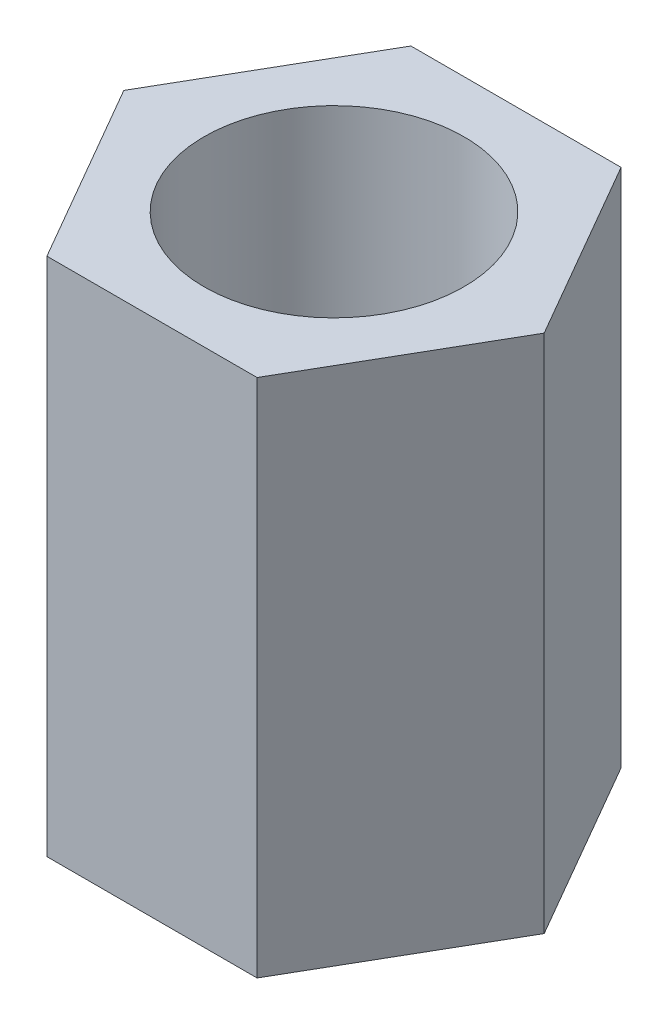
ISO-10303-21;
HEADER;
FILE_DESCRIPTION(('STEP AP214'),'2;1');
FILE_NAME('part.step','',(''),(''),'','','');
FILE_SCHEMA(('AUTOMOTIVE_DESIGN { 1 0 10303 214 1 1 1 1 }'));
ENDSEC;
DATA;
#1=APPLICATION_CONTEXT('core data for automotive mechanical design processes');
#2=APPLICATION_PROTOCOL_DEFINITION('international standard','automotive_design',2000,#1);
#3=PRODUCT_CONTEXT('',#1,'mechanical');
#4=PRODUCT('Part','Part','',(#3));
#5=PRODUCT_RELATED_PRODUCT_CATEGORY('part','',(#4));
#6=PRODUCT_DEFINITION_FORMATION('','',#4);
#7=PRODUCT_DEFINITION_CONTEXT('part definition',#1,'design');
#8=PRODUCT_DEFINITION('design','',#6,#7);
#9=PRODUCT_DEFINITION_SHAPE('','',#8);
#10=(LENGTH_UNIT() NAMED_UNIT(*) SI_UNIT(.MILLI.,.METRE.));
#11=(NAMED_UNIT(*) PLANE_ANGLE_UNIT() SI_UNIT($,.RADIAN.));
#12=(NAMED_UNIT(*) SI_UNIT($,.STERADIAN.) SOLID_ANGLE_UNIT());
#13=UNCERTAINTY_MEASURE_WITH_UNIT(LENGTH_MEASURE(1.E-05),#10,'distance_accuracy_value','');
#14=(GEOMETRIC_REPRESENTATION_CONTEXT(3) GLOBAL_UNCERTAINTY_ASSIGNED_CONTEXT((#13)) GLOBAL_UNIT_ASSIGNED_CONTEXT((#10,
#11,#12)) REPRESENTATION_CONTEXT('',''));
#15=CARTESIAN_POINT('',(0.,0.,0.));
#16=DIRECTION('',(0.,0.,1.));
#17=DIRECTION('',(1.,0.,0.));
#18=AXIS2_PLACEMENT_3D('',#15,#16,#17);
#19=CARTESIAN_POINT('',(0.,10.,0.));
#20=DIRECTION('',(0.,1.,0.));
#21=DIRECTION('',(0.,0.,1.));
#22=AXIS2_PLACEMENT_3D('',#19,#20,#21);
#23=PLANE('',#22);
#24=DIRECTION('',(-0.5,0.,-0.866025403784439));
#25=VECTOR('',#24,1.);
#26=CARTESIAN_POINT('',(4.04145188432738,10.,0.));
#27=LINE('',#26,#25);
#28=CARTESIAN_POINT('',(4.04145188432738,10.,0.));
#29=VERTEX_POINT('',#28);
#30=CARTESIAN_POINT('',(2.02072594216369,10.,-3.5));
#31=VERTEX_POINT('',#30);
#32=EDGE_CURVE('E152',#29,#31,#27,.T.);
#33=ORIENTED_EDGE('',*,*,#32,.T.);
#34=DIRECTION('',(-1.,0.,0.));
#35=VECTOR('',#34,1.);
#36=CARTESIAN_POINT('',(2.02072594216369,10.,-3.5));
#37=LINE('',#36,#35);
#38=CARTESIAN_POINT('',(-2.02072594216369,10.,-3.5));
#39=VERTEX_POINT('',#38);
#40=EDGE_CURVE('E100',#31,#39,#37,.T.);
#41=ORIENTED_EDGE('',*,*,#40,.T.);
#42=DIRECTION('',(-0.5,0.,0.866025403784438));
#43=VECTOR('',#42,1.);
#44=CARTESIAN_POINT('',(-2.02072594216369,10.,-3.5));
#45=LINE('',#44,#43);
#46=CARTESIAN_POINT('',(-4.04145188432738,10.,0.));
#47=VERTEX_POINT('',#46);
#48=EDGE_CURVE('E113',#39,#47,#45,.T.);
#49=ORIENTED_EDGE('',*,*,#48,.T.);
#50=DIRECTION('',(0.5,0.,0.866025403784439));
#51=VECTOR('',#50,1.);
#52=CARTESIAN_POINT('',(-4.04145188432738,10.,0.));
#53=LINE('',#52,#51);
#54=CARTESIAN_POINT('',(-2.02072594216369,10.,3.5));
#55=VERTEX_POINT('',#54);
#56=EDGE_CURVE('E107',#47,#55,#53,.T.);
#57=ORIENTED_EDGE('',*,*,#56,.T.);
#58=DIRECTION('',(1.,0.,0.));
#59=VECTOR('',#58,1.);
#60=CARTESIAN_POINT('',(-2.02072594216369,10.,3.5));
#61=LINE('',#60,#59);
#62=CARTESIAN_POINT('',(2.02072594216369,10.,3.5));
#63=VERTEX_POINT('',#62);
#64=EDGE_CURVE('E111',#55,#63,#61,.T.);
#65=ORIENTED_EDGE('',*,*,#64,.T.);
#66=DIRECTION('',(0.5,0.,-0.866025403784438));
#67=VECTOR('',#66,1.);
#68=CARTESIAN_POINT('',(2.02072594216369,10.,3.5));
#69=LINE('',#68,#67);
#70=EDGE_CURVE('E63',#63,#29,#69,.T.);
#71=ORIENTED_EDGE('',*,*,#70,.T.);
#72=EDGE_LOOP('',(#33,#41,#49,#57,#65,#71));
#73=FACE_BOUND('',#72,.T.);
#74=CARTESIAN_POINT('',(0.,10.,0.));
#75=DIRECTION('',(0.,1.,0.));
#76=DIRECTION('',(0.,0.,1.));
#77=AXIS2_PLACEMENT_3D('',#74,#75,#76);
#78=CIRCLE('',#77,2.5);
#79=CARTESIAN_POINT('',(0.,10.,2.5));
#80=VERTEX_POINT('',#79);
#81=EDGE_CURVE('E140',#80,#80,#78,.T.);
#82=ORIENTED_EDGE('',*,*,#81,.F.);
#83=EDGE_LOOP('',(#82));
#84=FACE_BOUND('',#83,.T.);
#85=ADVANCED_FACE('F45',(#73,#84),#23,.T.);
#86=CARTESIAN_POINT('',(0.,0.,0.));
#87=DIRECTION('',(0.,1.,0.));
#88=DIRECTION('',(0.,0.,1.));
#89=AXIS2_PLACEMENT_3D('',#86,#87,#88);
#90=PLANE('',#89);
#91=DIRECTION('',(-0.5,0.,-0.866025403784439));
#92=VECTOR('',#91,1.);
#93=CARTESIAN_POINT('',(4.04145188432738,0.,0.));
#94=LINE('',#93,#92);
#95=CARTESIAN_POINT('',(4.04145188432738,0.,0.));
#96=VERTEX_POINT('',#95);
#97=CARTESIAN_POINT('',(2.02072594216369,0.,-3.5));
#98=VERTEX_POINT('',#97);
#99=EDGE_CURVE('E135',#96,#98,#94,.T.);
#100=ORIENTED_EDGE('',*,*,#99,.F.);
#101=DIRECTION('',(0.5,0.,-0.866025403784438));
#102=VECTOR('',#101,1.);
#103=CARTESIAN_POINT('',(2.02072594216369,0.,3.5));
#104=LINE('',#103,#102);
#105=CARTESIAN_POINT('',(2.02072594216369,0.,3.5));
#106=VERTEX_POINT('',#105);
#107=EDGE_CURVE('E92',#106,#96,#104,.T.);
#108=ORIENTED_EDGE('',*,*,#107,.F.);
#109=DIRECTION('',(1.,0.,0.));
#110=VECTOR('',#109,1.);
#111=CARTESIAN_POINT('',(-2.02072594216369,0.,3.5));
#112=LINE('',#111,#110);
#113=CARTESIAN_POINT('',(-2.02072594216369,0.,3.5));
#114=VERTEX_POINT('',#113);
#115=EDGE_CURVE('E86',#114,#106,#112,.T.);
#116=ORIENTED_EDGE('',*,*,#115,.F.);
#117=DIRECTION('',(0.5,0.,0.866025403784439));
#118=VECTOR('',#117,1.);
#119=CARTESIAN_POINT('',(-4.04145188432738,0.,0.));
#120=LINE('',#119,#118);
#121=CARTESIAN_POINT('',(-4.04145188432738,0.,0.));
#122=VERTEX_POINT('',#121);
#123=EDGE_CURVE('E122',#122,#114,#120,.T.);
#124=ORIENTED_EDGE('',*,*,#123,.F.);
#125=DIRECTION('',(-0.5,0.,0.866025403784438));
#126=VECTOR('',#125,1.);
#127=CARTESIAN_POINT('',(-2.02072594216369,0.,-3.5));
#128=LINE('',#127,#126);
#129=CARTESIAN_POINT('',(-2.02072594216369,0.,-3.5));
#130=VERTEX_POINT('',#129);
#131=EDGE_CURVE('E143',#130,#122,#128,.T.);
#132=ORIENTED_EDGE('',*,*,#131,.F.);
#133=DIRECTION('',(-1.,0.,0.));
#134=VECTOR('',#133,1.);
#135=CARTESIAN_POINT('',(2.02072594216369,0.,-3.5));
#136=LINE('',#135,#134);
#137=EDGE_CURVE('E139',#98,#130,#136,.T.);
#138=ORIENTED_EDGE('',*,*,#137,.F.);
#139=EDGE_LOOP('',(#100,#108,#116,#124,#132,#138));
#140=FACE_BOUND('',#139,.T.);
#141=CARTESIAN_POINT('',(0.,0.,0.));
#142=DIRECTION('',(0.,1.,0.));
#143=DIRECTION('',(0.,0.,1.));
#144=AXIS2_PLACEMENT_3D('',#141,#142,#143);
#145=CIRCLE('',#144,2.5);
#146=CARTESIAN_POINT('',(0.,0.,2.5));
#147=VERTEX_POINT('',#146);
#148=EDGE_CURVE('E249',#147,#147,#145,.T.);
#149=ORIENTED_EDGE('',*,*,#148,.T.);
#150=EDGE_LOOP('',(#149));
#151=FACE_BOUND('',#150,.T.);
#152=ADVANCED_FACE('F165',(#140,#151),#90,.F.);
#153=CARTESIAN_POINT('',(4.04145188432738,10.,0.));
#154=DIRECTION('',(-0.866025403784438,0.,0.5));
#155=DIRECTION('',(0.5,0.,0.866025403784439));
#156=AXIS2_PLACEMENT_3D('',#153,#154,#155);
#157=PLANE('',#156);
#158=ORIENTED_EDGE('',*,*,#99,.T.);
#159=DIRECTION('',(0.,-1.,0.));
#160=VECTOR('',#159,1.);
#161=CARTESIAN_POINT('',(2.02072594216369,10.,-3.5));
#162=LINE('',#161,#160);
#163=EDGE_CURVE('E11',#31,#98,#162,.T.);
#164=ORIENTED_EDGE('',*,*,#163,.F.);
#165=ORIENTED_EDGE('',*,*,#32,.F.);
#166=DIRECTION('',(0.,-1.,0.));
#167=VECTOR('',#166,1.);
#168=CARTESIAN_POINT('',(4.04145188432738,10.,0.));
#169=LINE('',#168,#167);
#170=EDGE_CURVE('E131',#29,#96,#169,.T.);
#171=ORIENTED_EDGE('',*,*,#170,.T.);
#172=EDGE_LOOP('',(#158,#164,#165,#171));
#173=FACE_BOUND('',#172,.T.);
#174=ADVANCED_FACE('F47',(#173),#157,.F.);
#175=CARTESIAN_POINT('',(2.02072594216369,10.,-3.5));
#176=DIRECTION('',(0.,0.,1.));
#177=DIRECTION('',(1.,0.,0.));
#178=AXIS2_PLACEMENT_3D('',#175,#176,#177);
#179=PLANE('',#178);
#180=ORIENTED_EDGE('',*,*,#137,.T.);
#181=DIRECTION('',(0.,-1.,0.));
#182=VECTOR('',#181,1.);
#183=CARTESIAN_POINT('',(-2.02072594216369,10.,-3.5));
#184=LINE('',#183,#182);
#185=EDGE_CURVE('E55',#39,#130,#184,.T.);
#186=ORIENTED_EDGE('',*,*,#185,.F.);
#187=ORIENTED_EDGE('',*,*,#40,.F.);
#188=ORIENTED_EDGE('',*,*,#163,.T.);
#189=EDGE_LOOP('',(#180,#186,#187,#188));
#190=FACE_BOUND('',#189,.T.);
#191=ADVANCED_FACE('F190',(#190),#179,.F.);
#192=CARTESIAN_POINT('',(-2.02072594216369,10.,-3.5));
#193=DIRECTION('',(0.866025403784439,0.,0.5));
#194=DIRECTION('',(0.5,0.,-0.866025403784439));
#195=AXIS2_PLACEMENT_3D('',#192,#193,#194);
#196=PLANE('',#195);
#197=ORIENTED_EDGE('',*,*,#131,.T.);
#198=DIRECTION('',(0.,-1.,0.));
#199=VECTOR('',#198,1.);
#200=CARTESIAN_POINT('',(-4.04145188432738,10.,0.));
#201=LINE('',#200,#199);
#202=EDGE_CURVE('E124',#47,#122,#201,.T.);
#203=ORIENTED_EDGE('',*,*,#202,.F.);
#204=ORIENTED_EDGE('',*,*,#48,.F.);
#205=ORIENTED_EDGE('',*,*,#185,.T.);
#206=EDGE_LOOP('',(#197,#203,#204,#205));
#207=FACE_BOUND('',#206,.T.);
#208=ADVANCED_FACE('F162',(#207),#196,.F.);
#209=CARTESIAN_POINT('',(-4.04145188432738,10.,0.));
#210=DIRECTION('',(0.866025403784439,0.,-0.5));
#211=DIRECTION('',(-0.5,0.,-0.866025403784439));
#212=AXIS2_PLACEMENT_3D('',#209,#210,#211);
#213=PLANE('',#212);
#214=ORIENTED_EDGE('',*,*,#123,.T.);
#215=DIRECTION('',(0.,-1.,0.));
#216=VECTOR('',#215,1.);
#217=CARTESIAN_POINT('',(-2.02072594216369,10.,3.5));
#218=LINE('',#217,#216);
#219=EDGE_CURVE('E119',#55,#114,#218,.T.);
#220=ORIENTED_EDGE('',*,*,#219,.F.);
#221=ORIENTED_EDGE('',*,*,#56,.F.);
#222=ORIENTED_EDGE('',*,*,#202,.T.);
#223=EDGE_LOOP('',(#214,#220,#221,#222));
#224=FACE_BOUND('',#223,.T.);
#225=ADVANCED_FACE('F120',(#224),#213,.F.);
#226=CARTESIAN_POINT('',(-2.02072594216369,10.,3.5));
#227=DIRECTION('',(0.,0.,-1.));
#228=DIRECTION('',(-1.,0.,0.));
#229=AXIS2_PLACEMENT_3D('',#226,#227,#228);
#230=PLANE('',#229);
#231=ORIENTED_EDGE('',*,*,#115,.T.);
#232=DIRECTION('',(0.,-1.,0.));
#233=VECTOR('',#232,1.);
#234=CARTESIAN_POINT('',(2.02072594216369,10.,3.5));
#235=LINE('',#234,#233);
#236=EDGE_CURVE('E125',#63,#106,#235,.T.);
#237=ORIENTED_EDGE('',*,*,#236,.F.);
#238=ORIENTED_EDGE('',*,*,#64,.F.);
#239=ORIENTED_EDGE('',*,*,#219,.T.);
#240=EDGE_LOOP('',(#231,#237,#238,#239));
#241=FACE_BOUND('',#240,.T.);
#242=ADVANCED_FACE('F127',(#241),#230,.F.);
#243=CARTESIAN_POINT('',(2.02072594216369,10.,3.5));
#244=DIRECTION('',(-0.866025403784438,0.,-0.5));
#245=DIRECTION('',(-0.5,0.,0.866025403784439));
#246=AXIS2_PLACEMENT_3D('',#243,#244,#245);
#247=PLANE('',#246);
#248=ORIENTED_EDGE('',*,*,#107,.T.);
#249=ORIENTED_EDGE('',*,*,#170,.F.);
#250=ORIENTED_EDGE('',*,*,#70,.F.);
#251=ORIENTED_EDGE('',*,*,#236,.T.);
#252=EDGE_LOOP('',(#248,#249,#250,#251));
#253=FACE_BOUND('',#252,.T.);
#254=ADVANCED_FACE('F170',(#253),#247,.F.);
#255=CARTESIAN_POINT('',(0.,10.,0.));
#256=DIRECTION('',(0.,-1.,0.));
#257=DIRECTION('',(0.,0.,-1.));
#258=AXIS2_PLACEMENT_3D('',#255,#256,#257);
#259=CYLINDRICAL_SURFACE('',#258,2.5);
#260=ORIENTED_EDGE('',*,*,#81,.T.);
#261=EDGE_LOOP('',(#260));
#262=FACE_BOUND('',#261,.T.);
#263=ORIENTED_EDGE('',*,*,#148,.F.);
#264=EDGE_LOOP('',(#263));
#265=FACE_BOUND('',#264,.T.);
#266=ADVANCED_FACE('F172',(#262,#265),#259,.F.);
#267=CLOSED_SHELL('',(#85,#152,#174,#191,#208,#225,#242,#254,#266));
#268=MANIFOLD_SOLID_BREP('B2',#267);
#269=ADVANCED_BREP_SHAPE_REPRESENTATION('',(#18,#268),#14);
#270=SHAPE_DEFINITION_REPRESENTATION(#9,#269);
ENDSEC;
END-ISO-10303-21;
